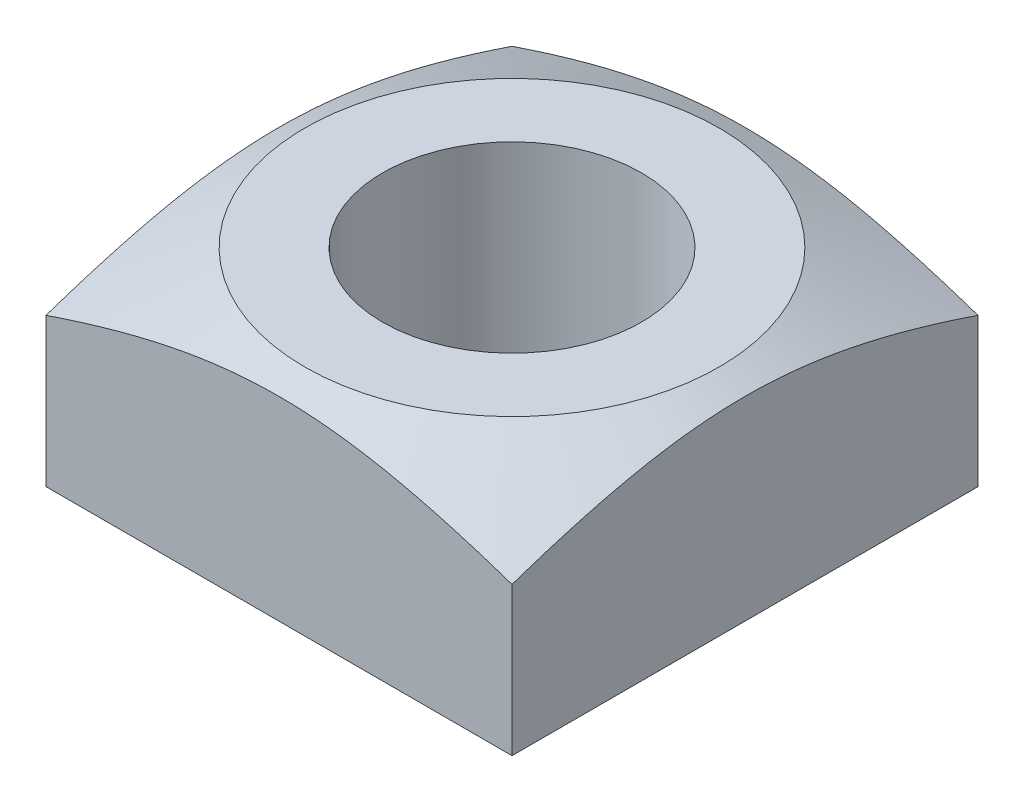
ISO-10303-21;
HEADER;
FILE_DESCRIPTION(('STEP AP214'),'2;1');
FILE_NAME('part.step','',(''),(''),'','','');
FILE_SCHEMA(('AUTOMOTIVE_DESIGN { 1 0 10303 214 1 1 1 1 }'));
ENDSEC;
DATA;
#1=APPLICATION_CONTEXT('core data for automotive mechanical design processes');
#2=APPLICATION_PROTOCOL_DEFINITION('international standard','automotive_design',2000,#1);
#3=PRODUCT_CONTEXT('',#1,'mechanical');
#4=PRODUCT('Part','Part','',(#3));
#5=PRODUCT_RELATED_PRODUCT_CATEGORY('part','',(#4));
#6=PRODUCT_DEFINITION_FORMATION('','',#4);
#7=PRODUCT_DEFINITION_CONTEXT('part definition',#1,'design');
#8=PRODUCT_DEFINITION('design','',#6,#7);
#9=PRODUCT_DEFINITION_SHAPE('','',#8);
#10=(LENGTH_UNIT() NAMED_UNIT(*) SI_UNIT(.MILLI.,.METRE.));
#11=(NAMED_UNIT(*) PLANE_ANGLE_UNIT() SI_UNIT($,.RADIAN.));
#12=(NAMED_UNIT(*) SI_UNIT($,.STERADIAN.) SOLID_ANGLE_UNIT());
#13=UNCERTAINTY_MEASURE_WITH_UNIT(LENGTH_MEASURE(1.E-05),#10,'distance_accuracy_value','');
#14=(GEOMETRIC_REPRESENTATION_CONTEXT(3) GLOBAL_UNCERTAINTY_ASSIGNED_CONTEXT((#13)) GLOBAL_UNIT_ASSIGNED_CONTEXT((#10,
#11,#12)) REPRESENTATION_CONTEXT('',''));
#15=CARTESIAN_POINT('',(0.,0.,0.));
#16=DIRECTION('',(0.,0.,1.));
#17=DIRECTION('',(1.,0.,0.));
#18=AXIS2_PLACEMENT_3D('',#15,#16,#17);
#19=CARTESIAN_POINT('',(0.,2.4,0.));
#20=DIRECTION('',(0.,1.,0.));
#21=DIRECTION('',(0.,0.,1.));
#22=AXIS2_PLACEMENT_3D('',#19,#20,#21);
#23=PLANE('',#22);
#24=CARTESIAN_POINT('',(0.,2.4,0.));
#25=DIRECTION('',(0.,1.,0.));
#26=DIRECTION('',(0.,0.,1.));
#27=AXIS2_PLACEMENT_3D('',#24,#25,#26);
#28=CIRCLE('',#27,1.5);
#29=CARTESIAN_POINT('',(0.,2.4,1.5));
#30=VERTEX_POINT('',#29);
#31=EDGE_CURVE('E120',#30,#30,#28,.T.);
#32=ORIENTED_EDGE('',*,*,#31,.F.);
#33=EDGE_LOOP('',(#32));
#34=FACE_BOUND('',#33,.T.);
#35=CARTESIAN_POINT('',(0.,2.4,0.));
#36=DIRECTION('',(0.,1.,0.));
#37=DIRECTION('',(0.,0.,1.));
#38=AXIS2_PLACEMENT_3D('',#35,#36,#37);
#39=CIRCLE('',#38,2.4);
#40=CARTESIAN_POINT('',(0.,2.4,2.4));
#41=VERTEX_POINT('',#40);
#42=EDGE_CURVE('E127',#41,#41,#39,.T.);
#43=ORIENTED_EDGE('',*,*,#42,.T.);
#44=EDGE_LOOP('',(#43));
#45=FACE_BOUND('',#44,.T.);
#46=ADVANCED_FACE('F40',(#34,#45),#23,.T.);
#47=CARTESIAN_POINT('',(0.,0.,0.));
#48=DIRECTION('',(0.,1.,0.));
#49=DIRECTION('',(0.,0.,1.));
#50=AXIS2_PLACEMENT_3D('',#47,#48,#49);
#51=PLANE('',#50);
#52=DIRECTION('',(0.,0.,1.));
#53=VECTOR('',#52,1.);
#54=CARTESIAN_POINT('',(-2.70000000000001,0.,2.69999999999999));
#55=LINE('',#54,#53);
#56=CARTESIAN_POINT('',(-2.70000000000001,0.,-2.70000000000001));
#57=VERTEX_POINT('',#56);
#58=CARTESIAN_POINT('',(-2.70000000000001,0.,2.69999999999999));
#59=VERTEX_POINT('',#58);
#60=EDGE_CURVE('E117',#57,#59,#55,.T.);
#61=ORIENTED_EDGE('',*,*,#60,.F.);
#62=DIRECTION('',(-1.,0.,0.));
#63=VECTOR('',#62,1.);
#64=CARTESIAN_POINT('',(2.69999999999999,0.,-2.70000000000001));
#65=LINE('',#64,#63);
#66=CARTESIAN_POINT('',(2.69999999999999,0.,-2.70000000000001));
#67=VERTEX_POINT('',#66);
#68=EDGE_CURVE('E97',#67,#57,#65,.T.);
#69=ORIENTED_EDGE('',*,*,#68,.F.);
#70=DIRECTION('',(0.,0.,-1.));
#71=VECTOR('',#70,1.);
#72=CARTESIAN_POINT('',(2.7,0.,2.7));
#73=LINE('',#72,#71);
#74=CARTESIAN_POINT('',(2.7,0.,2.7));
#75=VERTEX_POINT('',#74);
#76=EDGE_CURVE('E103',#75,#67,#73,.T.);
#77=ORIENTED_EDGE('',*,*,#76,.F.);
#78=DIRECTION('',(1.,0.,0.));
#79=VECTOR('',#78,1.);
#80=CARTESIAN_POINT('',(2.7,0.,2.7));
#81=LINE('',#80,#79);
#82=EDGE_CURVE('E112',#59,#75,#81,.T.);
#83=ORIENTED_EDGE('',*,*,#82,.F.);
#84=EDGE_LOOP('',(#61,#69,#77,#83));
#85=FACE_BOUND('',#84,.T.);
#86=CARTESIAN_POINT('',(0.,0.,0.));
#87=DIRECTION('',(0.,1.,0.));
#88=DIRECTION('',(0.,0.,1.));
#89=AXIS2_PLACEMENT_3D('',#86,#87,#88);
#90=CIRCLE('',#89,1.5);
#91=CARTESIAN_POINT('',(0.,0.,1.5));
#92=VERTEX_POINT('',#91);
#93=EDGE_CURVE('E92',#92,#92,#90,.T.);
#94=ORIENTED_EDGE('',*,*,#93,.T.);
#95=EDGE_LOOP('',(#94));
#96=FACE_BOUND('',#95,.T.);
#97=ADVANCED_FACE('F115',(#85,#96),#51,.F.);
#98=CARTESIAN_POINT('',(-2.70000000000001,2.4,2.69999999999999));
#99=DIRECTION('',(1.,0.,0.));
#100=DIRECTION('',(0.,0.,-1.));
#101=AXIS2_PLACEMENT_3D('',#98,#99,#100);
#102=PLANE('',#101);
#103=DIRECTION('',(0.,-1.,0.));
#104=VECTOR('',#103,1.);
#105=CARTESIAN_POINT('',(-2.70000000000001,2.4,2.69999999999999));
#106=LINE('',#105,#104);
#107=CARTESIAN_POINT('',(-2.70000000000029,1.71917922316458,2.69999999999999));
#108=VERTEX_POINT('',#107);
#109=EDGE_CURVE('E55',#108,#59,#106,.T.);
#110=ORIENTED_EDGE('',*,*,#109,.F.);
#111=CARTESIAN_POINT('',(-2.70000000000001,-0.606435247101683,8.23192667437573));
#112=CARTESIAN_POINT('',(-2.70000000000001,-0.506822215846075,8.01349467702338));
#113=CARTESIAN_POINT('',(-2.70000000000001,-0.40750804153311,7.79492548024702));
#114=CARTESIAN_POINT('',(-2.70000000000001,-0.209682707755097,7.35741473554905));
#115=CARTESIAN_POINT('',(-2.70000000000001,-0.111171577103838,7.13847317460445));
#116=CARTESIAN_POINT('',(-2.70000000000001,0.0849397759665151,6.69990152335025));
#117=CARTESIAN_POINT('',(-2.70000000000001,0.182538914464492,6.4802709476763));
#118=CARTESIAN_POINT('',(-2.70000000000001,0.376403252058409,6.04042685447661));
#119=CARTESIAN_POINT('',(-2.70000000000001,0.472668479636916,5.82021334951793));
#120=CARTESIAN_POINT('',(-2.70000000000001,0.671554672542732,5.36022219683892));
#121=CARTESIAN_POINT('',(-2.70000000000001,0.774018308811196,5.12037630283562));
#122=CARTESIAN_POINT('',(-2.70000000000001,0.976006948004834,4.63945259953601));
#123=CARTESIAN_POINT('',(-2.70000000000001,1.07553200603543,4.39837481344023));
#124=CARTESIAN_POINT('',(-2.70000000000001,1.27031686857536,3.9145006293873));
#125=CARTESIAN_POINT('',(-2.70000000000001,1.36557691831542,3.67170433117371));
#126=CARTESIAN_POINT('',(-2.70000000000001,1.50358143775901,3.30567931459696));
#127=CARTESIAN_POINT('',(-2.70000000000001,1.54876651769645,3.18337212906639));
#128=CARTESIAN_POINT('',(-2.70000000000001,1.63708505119091,2.93802105780318));
#129=CARTESIAN_POINT('',(-2.70000000000001,1.68021857669607,2.81497719807638));
#130=CARTESIAN_POINT('',(-2.70000000000001,1.76479613598742,2.56539403710119));
#131=CARTESIAN_POINT('',(-2.70000000000001,1.80618497332129,2.43883593004486));
#132=CARTESIAN_POINT('',(-2.70000000000001,1.88553581877887,2.1846554683488));
#133=CARTESIAN_POINT('',(-2.70000000000001,1.92349815817011,2.05703321789447));
#134=CARTESIAN_POINT('',(-2.70000000000001,1.9950515865891,1.80058310364117));
#135=CARTESIAN_POINT('',(-2.70000000000001,2.0286435037053,1.67175547320542));
#136=CARTESIAN_POINT('',(-2.70000000000001,2.09030148832002,1.41276667988722));
#137=CARTESIAN_POINT('',(-2.70000000000001,2.11836758590939,1.28260552427055));
#138=CARTESIAN_POINT('',(-2.70000000000001,2.16697360111399,1.02451675874272));
#139=CARTESIAN_POINT('',(-2.70000000000001,2.18769693400819,0.896624265870415));
#140=CARTESIAN_POINT('',(-2.70000000000001,2.22142664655635,0.639818060645532));
#141=CARTESIAN_POINT('',(-2.70000000000001,2.23443388357094,0.510904463364826));
#142=CARTESIAN_POINT('',(-2.70000000000001,2.25178276757696,0.252646946090538));
#143=CARTESIAN_POINT('',(-2.70000000000001,2.25613549071915,0.123303788607147));
#144=CARTESIAN_POINT('',(-2.70000000000001,2.25585803505028,-0.135373186766508));
#145=CARTESIAN_POINT('',(-2.70000000000001,2.25122782019563,-0.264707004617214));
#146=CARTESIAN_POINT('',(-2.70000000000001,2.23335420909054,-0.52279990649601));
#147=CARTESIAN_POINT('',(-2.70000000000001,2.22010838049752,-0.651558817878641));
#148=CARTESIAN_POINT('',(-2.70000000000001,2.18595123928292,-0.908047247042929));
#149=CARTESIAN_POINT('',(-2.70000000000001,2.16503914149077,-1.03577665801441));
#150=CARTESIAN_POINT('',(-2.70000000000001,2.11672590597123,-1.29024066840712));
#151=CARTESIAN_POINT('',(-2.70000000000001,2.08931213144147,-1.41697282763452));
#152=CARTESIAN_POINT('',(-2.70000000000001,2.02924630518163,-1.66917265822671));
#153=CARTESIAN_POINT('',(-2.70000000000001,1.99659427143826,-1.79464033393182));
#154=CARTESIAN_POINT('',(-2.70000000000001,1.92613474535251,-2.04797923026407));
#155=CARTESIAN_POINT('',(-2.70000000000001,1.88820650714308,-2.17581655339833));
#156=CARTESIAN_POINT('',(-2.70000000000001,1.8088991283155,-2.43040716279315));
#157=CARTESIAN_POINT('',(-2.70000000000001,1.76752000500831,-2.55716045448811));
#158=CARTESIAN_POINT('',(-2.70000000000001,1.68209473047967,-2.80962415323683));
#159=CARTESIAN_POINT('',(-2.70000000000001,1.63805118726447,-2.93533544741497));
#160=CARTESIAN_POINT('',(-2.70000000000001,1.54782487849784,-3.18598968451544));
#161=CARTESIAN_POINT('',(-2.70000000000001,1.50164203659316,-3.31093259983317));
#162=CARTESIAN_POINT('',(-2.70000000000001,1.37529940284181,-3.64572197686884));
#163=CARTESIAN_POINT('',(-2.70000000000001,1.29357735156,-3.85497793018507));
#164=CARTESIAN_POINT('',(-2.70000000000001,1.12678758066689,-4.27215145086381));
#165=CARTESIAN_POINT('',(-2.70000000000001,1.04171972856756,-4.48006896484629));
#166=CARTESIAN_POINT('',(-2.70000000000001,0.869140853428636,-4.89498497328981));
#167=CARTESIAN_POINT('',(-2.70000000000001,0.781628844274619,-5.10198305659208));
#168=CARTESIAN_POINT('',(-2.70000000000001,0.604828100084038,-5.51521885976111));
#169=CARTESIAN_POINT('',(-2.70000000000001,0.515539352242739,-5.72145657413529));
#170=CARTESIAN_POINT('',(-2.70000000000001,0.341315330656772,-6.12030386527071));
#171=CARTESIAN_POINT('',(-2.70000000000001,0.256462399772668,-6.31294946626508));
#172=CARTESIAN_POINT('',(-2.70000000000001,0.0858312489666655,-6.69783145015282));
#173=CARTESIAN_POINT('',(-2.70000000000001,5.3023552096018E-05,-6.89006783060888));
#174=CARTESIAN_POINT('',(-2.70000000000001,-0.172172180875994,-7.27406276161231));
#175=CARTESIAN_POINT('',(-2.70000000000001,-0.258618594318572,-7.46582156606016));
#176=CARTESIAN_POINT('',(-2.70000000000001,-0.432110616019693,-7.84906479320019));
#177=CARTESIAN_POINT('',(-2.70000000000001,-0.519156215923214,-8.04054921967349));
#178=CARTESIAN_POINT('',(-2.70000000000001,-0.60643524710169,-8.23192667437574));
#179=B_SPLINE_CURVE_WITH_KNOTS('',3,(#111,#112,#113,#114,#115,#116,#117,#118,#119,#120,#121,
#122,#123,#124,#125,#126,#127,#128,#129,#130,#131,#132,#133,#134,#135,#136,#137,#138,#139,#140,
#141,#142,#143,#144,#145,#146,#147,#148,#149,#150,#151,#152,#153,#154,#155,#156,#157,#158,#159,
#160,#161,#162,#163,#164,#165,#166,#167,#168,#169,#170,#171,#172,#173,#174,#175,#176,#177,#178),
.UNSPECIFIED.,.F.,.F.,(4,2,2,2,2,2,2,2,2,2,2,2,2,2,2,2,2,2,2,2,2,2,2,2,2,2,2,2,2,2,2,2,2,4),(0.,
0.720221554211858,1.44046883774401,2.16148451475411,2.88248477235222,3.66491746483832,
4.44733547549691,5.22970844052507,5.62085525746432,6.01198834672753,6.41141271220445,
6.81079842061164,7.21010834461465,7.60941609411566,7.99789809332225,8.38633691893544,
8.77427829506383,9.16222122779064,9.55027373134427,9.93836598990308,10.3272188257001,
10.716070326315,11.1160439034166,11.5160154742171,11.9156016853266,12.3152021689834,
12.989098009983,13.6630205630298,14.337219059243,15.011422416082,15.6429343889301,
16.2744501125816,16.905479748322,17.5365006027746),.UNSPECIFIED.);
#180=CARTESIAN_POINT('',(-2.69999999999994,1.7191792231645,-2.70000000000001));
#181=VERTEX_POINT('',#180);
#182=EDGE_CURVE('E87',#108,#181,#179,.T.);
#183=ORIENTED_EDGE('',*,*,#182,.T.);
#184=DIRECTION('',(0.,-1.,0.));
#185=VECTOR('',#184,1.);
#186=CARTESIAN_POINT('',(-2.70000000000001,2.4,-2.70000000000001));
#187=LINE('',#186,#185);
#188=EDGE_CURVE('E69',#181,#57,#187,.T.);
#189=ORIENTED_EDGE('',*,*,#188,.T.);
#190=ORIENTED_EDGE('',*,*,#60,.T.);
#191=EDGE_LOOP('',(#110,#183,#189,#190));
#192=FACE_BOUND('',#191,.T.);
#193=ADVANCED_FACE('F42',(#192),#102,.F.);
#194=CARTESIAN_POINT('',(2.7,2.4,2.7));
#195=DIRECTION('',(0.,0.,-1.));
#196=DIRECTION('',(-1.,0.,0.));
#197=AXIS2_PLACEMENT_3D('',#194,#195,#196);
#198=PLANE('',#197);
#199=DIRECTION('',(0.,-1.,0.));
#200=VECTOR('',#199,1.);
#201=CARTESIAN_POINT('',(2.7,2.4,2.7));
#202=LINE('',#201,#200);
#203=CARTESIAN_POINT('',(2.7,1.71917922316459,2.70000000000027));
#204=VERTEX_POINT('',#203);
#205=EDGE_CURVE('E101',#204,#75,#202,.T.);
#206=ORIENTED_EDGE('',*,*,#205,.F.);
#207=CARTESIAN_POINT('',(8.23192667437574,-0.606435247101685,2.7));
#208=CARTESIAN_POINT('',(8.01349467702339,-0.506822215846078,2.7));
#209=CARTESIAN_POINT('',(7.79492548024703,-0.407508041533113,2.7));
#210=CARTESIAN_POINT('',(7.35741473554906,-0.209682707755099,2.7));
#211=CARTESIAN_POINT('',(7.13847317460446,-0.11117157710384,2.7));
#212=CARTESIAN_POINT('',(6.69990152335026,0.0849397759665129,2.7));
#213=CARTESIAN_POINT('',(6.48027094767631,0.182538914464489,2.7));
#214=CARTESIAN_POINT('',(6.04042685447662,0.376403252058406,2.7));
#215=CARTESIAN_POINT('',(5.82021334951793,0.472668479636914,2.7));
#216=CARTESIAN_POINT('',(5.36022219683893,0.671554672542731,2.7));
#217=CARTESIAN_POINT('',(5.12037630283562,0.774018308811195,2.7));
#218=CARTESIAN_POINT('',(4.63945259953602,0.976006948004834,2.7));
#219=CARTESIAN_POINT('',(4.39837481344024,1.07553200603543,2.7));
#220=CARTESIAN_POINT('',(3.91450062938731,1.27031686857536,2.7));
#221=CARTESIAN_POINT('',(3.67170433117372,1.36557691831542,2.7));
#222=CARTESIAN_POINT('',(3.30567931459697,1.50358143775901,2.7));
#223=CARTESIAN_POINT('',(3.1833721290664,1.54876651769645,2.7));
#224=CARTESIAN_POINT('',(2.93802105780319,1.63708505119091,2.7));
#225=CARTESIAN_POINT('',(2.8149771980764,1.68021857669607,2.7));
#226=CARTESIAN_POINT('',(2.5653940371012,1.76479613598742,2.7));
#227=CARTESIAN_POINT('',(2.43883593004487,1.80618497332129,2.7));
#228=CARTESIAN_POINT('',(2.18465546834881,1.88553581877887,2.7));
#229=CARTESIAN_POINT('',(2.05703321789448,1.92349815817012,2.7));
#230=CARTESIAN_POINT('',(1.80058310364119,1.9950515865891,2.7));
#231=CARTESIAN_POINT('',(1.67175547320543,2.02864350370531,2.7));
#232=CARTESIAN_POINT('',(1.41276667988724,2.09030148832003,2.7));
#233=CARTESIAN_POINT('',(1.28260552427056,2.11836758590939,2.7));
#234=CARTESIAN_POINT('',(1.02451675874274,2.16697360111399,2.7));
#235=CARTESIAN_POINT('',(0.896624265870433,2.18769693400819,2.7));
#236=CARTESIAN_POINT('',(0.63981806064555,2.22142664655636,2.7));
#237=CARTESIAN_POINT('',(0.510904463364845,2.23443388357095,2.7));
#238=CARTESIAN_POINT('',(0.252646946090558,2.25178276757696,2.7));
#239=CARTESIAN_POINT('',(0.123303788607168,2.25613549071916,2.7));
#240=CARTESIAN_POINT('',(-0.135373186766486,2.25585803505029,2.7));
#241=CARTESIAN_POINT('',(-0.264707004617191,2.25122782019564,2.7));
#242=CARTESIAN_POINT('',(-0.522799906495988,2.23335420909055,2.7));
#243=CARTESIAN_POINT('',(-0.651558817878619,2.22010838049753,2.7));
#244=CARTESIAN_POINT('',(-0.908047247042907,2.18595123928294,2.7));
#245=CARTESIAN_POINT('',(-1.03577665801438,2.16503914149078,2.69999999999999));
#246=CARTESIAN_POINT('',(-1.2902406684071,2.11672590597125,2.69999999999999));
#247=CARTESIAN_POINT('',(-1.41697282763449,2.08931213144148,2.69999999999999));
#248=CARTESIAN_POINT('',(-1.66917265822669,2.02924630518164,2.69999999999999));
#249=CARTESIAN_POINT('',(-1.79464033393179,1.99659427143827,2.69999999999999));
#250=CARTESIAN_POINT('',(-2.04797923026405,1.92613474535253,2.69999999999999));
#251=CARTESIAN_POINT('',(-2.17581655339831,1.8882065071431,2.69999999999999));
#252=CARTESIAN_POINT('',(-2.43040716279312,1.80889912831551,2.69999999999999));
#253=CARTESIAN_POINT('',(-2.55716045448809,1.76752000500833,2.69999999999999));
#254=CARTESIAN_POINT('',(-2.8096241532368,1.68209473047969,2.69999999999999));
#255=CARTESIAN_POINT('',(-2.93533544741494,1.63805118726449,2.69999999999999));
#256=CARTESIAN_POINT('',(-3.18598968451541,1.54782487849785,2.69999999999999));
#257=CARTESIAN_POINT('',(-3.31093259983314,1.50164203659318,2.69999999999999));
#258=CARTESIAN_POINT('',(-3.64572197686881,1.37529940284183,2.69999999999999));
#259=CARTESIAN_POINT('',(-3.85497793018504,1.29357735156002,2.69999999999999));
#260=CARTESIAN_POINT('',(-4.27215145086379,1.1267875806669,2.69999999999999));
#261=CARTESIAN_POINT('',(-4.48006896484627,1.04171972856757,2.69999999999999));
#262=CARTESIAN_POINT('',(-4.8949849732898,0.869140853428646,2.69999999999999));
#263=CARTESIAN_POINT('',(-5.10198305659206,0.781628844274628,2.69999999999999));
#264=CARTESIAN_POINT('',(-5.5152188597611,0.604828100084046,2.69999999999999));
#265=CARTESIAN_POINT('',(-5.72145657413529,0.515539352242746,2.69999999999999));
#266=CARTESIAN_POINT('',(-6.12030386527071,0.341315330656778,2.69999999999999));
#267=CARTESIAN_POINT('',(-6.31294946626507,0.256462399772674,2.69999999999999));
#268=CARTESIAN_POINT('',(-6.69783145015281,0.0858312489666705,2.69999999999999));
#269=CARTESIAN_POINT('',(-6.89006783060888,5.30235521005717E-05,2.69999999999999));
#270=CARTESIAN_POINT('',(-7.27406276161231,-0.172172180875991,2.69999999999999));
#271=CARTESIAN_POINT('',(-7.46582156606016,-0.25861859431857,2.69999999999999));
#272=CARTESIAN_POINT('',(-7.84906479320019,-0.432110616019693,2.69999999999999));
#273=CARTESIAN_POINT('',(-8.0405492196735,-0.519156215923214,2.69999999999999));
#274=CARTESIAN_POINT('',(-8.23192667437575,-0.60643524710169,2.69999999999999));
#275=B_SPLINE_CURVE_WITH_KNOTS('',3,(#207,#208,#209,#210,#211,#212,#213,#214,#215,#216,#217,
#218,#219,#220,#221,#222,#223,#224,#225,#226,#227,#228,#229,#230,#231,#232,#233,#234,#235,#236,
#237,#238,#239,#240,#241,#242,#243,#244,#245,#246,#247,#248,#249,#250,#251,#252,#253,#254,#255,
#256,#257,#258,#259,#260,#261,#262,#263,#264,#265,#266,#267,#268,#269,#270,#271,#272,#273,#274),
.UNSPECIFIED.,.F.,.F.,(4,2,2,2,2,2,2,2,2,2,2,2,2,2,2,2,2,2,2,2,2,2,2,2,2,2,2,2,2,2,2,2,2,4),(0.,
0.720221554211857,1.44046883774401,2.16148451475411,2.88248477235222,3.66491746483832,
4.44733547549691,5.22970844052507,5.62085525746432,6.01198834672753,6.41141271220445,
6.81079842061163,7.21010834461465,7.60941609411566,7.99789809332225,8.38633691893543,
8.77427829506382,9.16222122779063,9.55027373134426,9.93836598990307,10.3272188257001,
10.716070326315,11.1160439034166,11.5160154742171,11.9156016853265,12.3152021689834,
12.989098009983,13.6630205630298,14.337219059243,15.011422416082,15.6429343889301,
16.2744501125817,16.905479748322,17.5365006027746),.UNSPECIFIED.);
#276=EDGE_CURVE('E93',#204,#108,#275,.T.);
#277=ORIENTED_EDGE('',*,*,#276,.T.);
#278=ORIENTED_EDGE('',*,*,#109,.T.);
#279=ORIENTED_EDGE('',*,*,#82,.T.);
#280=EDGE_LOOP('',(#206,#277,#278,#279));
#281=FACE_BOUND('',#280,.T.);
#282=ADVANCED_FACE('F111',(#281),#198,.F.);
#283=CARTESIAN_POINT('',(2.7,2.4,2.7));
#284=DIRECTION('',(-1.,0.,0.));
#285=DIRECTION('',(0.,0.,1.));
#286=AXIS2_PLACEMENT_3D('',#283,#284,#285);
#287=PLANE('',#286);
#288=DIRECTION('',(0.,-1.,0.));
#289=VECTOR('',#288,1.);
#290=CARTESIAN_POINT('',(2.69999999999999,2.4,-2.70000000000001));
#291=LINE('',#290,#289);
#292=CARTESIAN_POINT('',(2.69999999999999,1.71917922316447,-2.70000000000001));
#293=VERTEX_POINT('',#292);
#294=EDGE_CURVE('E99',#293,#67,#291,.T.);
#295=ORIENTED_EDGE('',*,*,#294,.F.);
#296=CARTESIAN_POINT('',(2.69999999999998,-0.606435247101692,-8.23192667437576));
#297=CARTESIAN_POINT('',(2.69999999999998,-0.506822215846085,-8.01349467702341));
#298=CARTESIAN_POINT('',(2.69999999999998,-0.40750804153312,-7.79492548024705));
#299=CARTESIAN_POINT('',(2.69999999999998,-0.209682707755106,-7.35741473554908));
#300=CARTESIAN_POINT('',(2.69999999999999,-0.111171577103847,-7.13847317460448));
#301=CARTESIAN_POINT('',(2.69999999999999,0.0849397759665071,-6.69990152335028));
#302=CARTESIAN_POINT('',(2.69999999999999,0.182538914464483,-6.48027094767633));
#303=CARTESIAN_POINT('',(2.69999999999999,0.376403252058401,-6.04042685447664));
#304=CARTESIAN_POINT('',(2.69999999999999,0.472668479636909,-5.82021334951795));
#305=CARTESIAN_POINT('',(2.69999999999999,0.671554672542726,-5.36022219683895));
#306=CARTESIAN_POINT('',(2.69999999999999,0.774018308811191,-5.12037630283564));
#307=CARTESIAN_POINT('',(2.69999999999999,0.97600694800483,-4.63945259953604));
#308=CARTESIAN_POINT('',(2.69999999999999,1.07553200603542,-4.39837481344026));
#309=CARTESIAN_POINT('',(2.69999999999999,1.27031686857536,-3.91450062938732));
#310=CARTESIAN_POINT('',(2.69999999999999,1.36557691831541,-3.67170433117373));
#311=CARTESIAN_POINT('',(2.69999999999999,1.50358143775901,-3.30567931459698));
#312=CARTESIAN_POINT('',(2.69999999999999,1.54876651769645,-3.18337212906641));
#313=CARTESIAN_POINT('',(2.69999999999999,1.63708505119091,-2.9380210578032));
#314=CARTESIAN_POINT('',(2.69999999999999,1.68021857669607,-2.8149771980764));
#315=CARTESIAN_POINT('',(2.69999999999999,1.76479613598742,-2.56539403710121));
#316=CARTESIAN_POINT('',(2.69999999999999,1.80618497332129,-2.43883593004488));
#317=CARTESIAN_POINT('',(2.69999999999999,1.88553581877887,-2.18465546834882));
#318=CARTESIAN_POINT('',(2.69999999999999,1.92349815817012,-2.05703321789449));
#319=CARTESIAN_POINT('',(2.69999999999999,1.99505158658911,-1.80058310364119));
#320=CARTESIAN_POINT('',(2.69999999999999,2.02864350370531,-1.67175547320544));
#321=CARTESIAN_POINT('',(2.69999999999999,2.09030148832003,-1.41276667988724));
#322=CARTESIAN_POINT('',(2.69999999999999,2.11836758590939,-1.28260552427057));
#323=CARTESIAN_POINT('',(2.69999999999999,2.16697360111399,-1.02451675874274));
#324=CARTESIAN_POINT('',(2.69999999999999,2.18769693400819,-0.896624265870438));
#325=CARTESIAN_POINT('',(2.69999999999999,2.22142664655636,-0.639818060645556));
#326=CARTESIAN_POINT('',(2.69999999999999,2.23443388357095,-0.51090446336485));
#327=CARTESIAN_POINT('',(2.69999999999999,2.25178276757696,-0.252646946090562));
#328=CARTESIAN_POINT('',(2.69999999999999,2.25613549071916,-0.123303788607171));
#329=CARTESIAN_POINT('',(2.69999999999999,2.25585803505029,0.135373186766483));
#330=CARTESIAN_POINT('',(2.69999999999999,2.25122782019564,0.264707004617189));
#331=CARTESIAN_POINT('',(2.69999999999999,2.23335420909055,0.522799906495986));
#332=CARTESIAN_POINT('',(2.69999999999999,2.22010838049753,0.651558817878617));
#333=CARTESIAN_POINT('',(2.69999999999999,2.18595123928294,0.908047247042904));
#334=CARTESIAN_POINT('',(2.69999999999999,2.16503914149078,1.03577665801438));
#335=CARTESIAN_POINT('',(2.7,2.11672590597125,1.29024066840709));
#336=CARTESIAN_POINT('',(2.7,2.08931213144148,1.41697282763449));
#337=CARTESIAN_POINT('',(2.7,2.02924630518164,1.66917265822668));
#338=CARTESIAN_POINT('',(2.7,1.99659427143827,1.79464033393179));
#339=CARTESIAN_POINT('',(2.7,1.92613474535253,2.04797923026405));
#340=CARTESIAN_POINT('',(2.7,1.88820650714309,2.17581655339831));
#341=CARTESIAN_POINT('',(2.7,1.80889912831551,2.43040716279312));
#342=CARTESIAN_POINT('',(2.7,1.76752000500833,2.55716045448809));
#343=CARTESIAN_POINT('',(2.7,1.68209473047969,2.8096241532368));
#344=CARTESIAN_POINT('',(2.7,1.63805118726449,2.93533544741494));
#345=CARTESIAN_POINT('',(2.7,1.54782487849785,3.18598968451541));
#346=CARTESIAN_POINT('',(2.7,1.50164203659318,3.31093259983314));
#347=CARTESIAN_POINT('',(2.7,1.37529940284182,3.64572197686881));
#348=CARTESIAN_POINT('',(2.7,1.29357735156002,3.85497793018504));
#349=CARTESIAN_POINT('',(2.7,1.1267875806669,4.27215145086379));
#350=CARTESIAN_POINT('',(2.7,1.04171972856757,4.48006896484627));
#351=CARTESIAN_POINT('',(2.7,0.869140853428645,4.89498497328979));
#352=CARTESIAN_POINT('',(2.7,0.781628844274627,5.10198305659206));
#353=CARTESIAN_POINT('',(2.7,0.604828100084046,5.5152188597611));
#354=CARTESIAN_POINT('',(2.7,0.515539352242746,5.72145657413528));
#355=CARTESIAN_POINT('',(2.7,0.341315330656778,6.1203038652707));
#356=CARTESIAN_POINT('',(2.7,0.256462399772674,6.31294946626507));
#357=CARTESIAN_POINT('',(2.7,0.0858312489666704,6.69783145015281));
#358=CARTESIAN_POINT('',(2.7,5.30235521008834E-05,6.89006783060888));
#359=CARTESIAN_POINT('',(2.7,-0.17217218087599,7.27406276161231));
#360=CARTESIAN_POINT('',(2.7,-0.258618594318569,7.46582156606015));
#361=CARTESIAN_POINT('',(2.7,-0.43211061601969,7.84906479320019));
#362=CARTESIAN_POINT('',(2.7,-0.519156215923211,8.04054921967349));
#363=CARTESIAN_POINT('',(2.7,-0.606435247101687,8.23192667437574));
#364=B_SPLINE_CURVE_WITH_KNOTS('',3,(#296,#297,#298,#299,#300,#301,#302,#303,#304,#305,#306,
#307,#308,#309,#310,#311,#312,#313,#314,#315,#316,#317,#318,#319,#320,#321,#322,#323,#324,#325,
#326,#327,#328,#329,#330,#331,#332,#333,#334,#335,#336,#337,#338,#339,#340,#341,#342,#343,#344,
#345,#346,#347,#348,#349,#350,#351,#352,#353,#354,#355,#356,#357,#358,#359,#360,#361,#362,#363),
.UNSPECIFIED.,.F.,.F.,(4,2,2,2,2,2,2,2,2,2,2,2,2,2,2,2,2,2,2,2,2,2,2,2,2,2,2,2,2,2,2,2,2,4),(0.,
0.720221554211857,1.44046883774401,2.16148451475412,2.88248477235223,3.66491746483833,
4.44733547549692,5.22970844052508,5.62085525746433,6.01198834672754,6.41141271220447,
6.81079842061165,7.21010834461466,7.60941609411568,7.99789809332227,8.38633691893545,
8.77427829506384,9.16222122779065,9.55027373134428,9.93836598990309,10.3272188257001,
10.716070326315,11.1160439034166,11.5160154742171,11.9156016853266,12.3152021689834,
12.989098009983,13.6630205630298,14.337219059243,15.011422416082,15.6429343889301,
16.2744501125817,16.905479748322,17.5365006027746),.UNSPECIFIED.);
#365=EDGE_CURVE('E62',#293,#204,#364,.T.);
#366=ORIENTED_EDGE('',*,*,#365,.T.);
#367=ORIENTED_EDGE('',*,*,#205,.T.);
#368=ORIENTED_EDGE('',*,*,#76,.T.);
#369=EDGE_LOOP('',(#295,#366,#367,#368));
#370=FACE_BOUND('',#369,.T.);
#371=ADVANCED_FACE('F126',(#370),#287,.F.);
#372=CARTESIAN_POINT('',(2.69999999999999,2.4,-2.70000000000001));
#373=DIRECTION('',(0.,0.,1.));
#374=DIRECTION('',(1.,0.,0.));
#375=AXIS2_PLACEMENT_3D('',#372,#373,#374);
#376=PLANE('',#375);
#377=ORIENTED_EDGE('',*,*,#188,.F.);
#378=CARTESIAN_POINT('',(-8.23192667437575,-0.606435247101689,-2.7));
#379=CARTESIAN_POINT('',(-8.0134946770234,-0.506822215846082,-2.7));
#380=CARTESIAN_POINT('',(-7.79492548024703,-0.407508041533116,-2.7));
#381=CARTESIAN_POINT('',(-7.35741473554906,-0.209682707755103,-2.7));
#382=CARTESIAN_POINT('',(-7.13847317460446,-0.111171577103844,-2.7));
#383=CARTESIAN_POINT('',(-6.69990152335027,0.0849397759665104,-2.7));
#384=CARTESIAN_POINT('',(-6.48027094767632,0.182538914464487,-2.7));
#385=CARTESIAN_POINT('',(-6.04042685447662,0.376403252058405,-2.7));
#386=CARTESIAN_POINT('',(-5.82021334951794,0.472668479636912,-2.7));
#387=CARTESIAN_POINT('',(-5.36022219683893,0.671554672542728,-2.7));
#388=CARTESIAN_POINT('',(-5.12037630283563,0.774018308811193,-2.70000000000001));
#389=CARTESIAN_POINT('',(-4.63945259953602,0.976006948004831,-2.70000000000001));
#390=CARTESIAN_POINT('',(-4.39837481344024,1.07553200603542,-2.70000000000001));
#391=CARTESIAN_POINT('',(-3.91450062938731,1.27031686857536,-2.70000000000001));
#392=CARTESIAN_POINT('',(-3.67170433117372,1.36557691831541,-2.70000000000001));
#393=CARTESIAN_POINT('',(-3.30567931459697,1.50358143775901,-2.70000000000001));
#394=CARTESIAN_POINT('',(-3.1833721290664,1.54876651769645,-2.70000000000001));
#395=CARTESIAN_POINT('',(-2.93802105780319,1.6370850511909,-2.70000000000001));
#396=CARTESIAN_POINT('',(-2.81497719807639,1.68021857669607,-2.70000000000001));
#397=CARTESIAN_POINT('',(-2.5653940371012,1.76479613598742,-2.70000000000001));
#398=CARTESIAN_POINT('',(-2.43883593004487,1.80618497332129,-2.70000000000001));
#399=CARTESIAN_POINT('',(-2.18465546834881,1.88553581877887,-2.70000000000001));
#400=CARTESIAN_POINT('',(-2.05703321789448,1.92349815817011,-2.70000000000001));
#401=CARTESIAN_POINT('',(-1.80058310364118,1.9950515865891,-2.70000000000001));
#402=CARTESIAN_POINT('',(-1.67175547320543,2.0286435037053,-2.70000000000001));
#403=CARTESIAN_POINT('',(-1.41276667988723,2.09030148832002,-2.70000000000001));
#404=CARTESIAN_POINT('',(-1.28260552427055,2.11836758590939,-2.70000000000001));
#405=CARTESIAN_POINT('',(-1.02451675874273,2.16697360111399,-2.70000000000001));
#406=CARTESIAN_POINT('',(-0.896624265870423,2.18769693400819,-2.70000000000001));
#407=CARTESIAN_POINT('',(-0.63981806064554,2.22142664655635,-2.70000000000001));
#408=CARTESIAN_POINT('',(-0.510904463364834,2.23443388357094,-2.70000000000001));
#409=CARTESIAN_POINT('',(-0.252646946090547,2.25178276757696,-2.70000000000001));
#410=CARTESIAN_POINT('',(-0.123303788607155,2.25613549071915,-2.70000000000001));
#411=CARTESIAN_POINT('',(0.1353731867665,2.25585803505028,-2.70000000000001));
#412=CARTESIAN_POINT('',(0.264707004617206,2.25122782019563,-2.70000000000001));
#413=CARTESIAN_POINT('',(0.522799906496003,2.23335420909054,-2.70000000000001));
#414=CARTESIAN_POINT('',(0.651558817878635,2.22010838049752,-2.70000000000001));
#415=CARTESIAN_POINT('',(0.908047247042922,2.18595123928292,-2.70000000000001));
#416=CARTESIAN_POINT('',(1.0357766580144,2.16503914149077,-2.70000000000001));
#417=CARTESIAN_POINT('',(1.29024066840711,2.11672590597124,-2.70000000000001));
#418=CARTESIAN_POINT('',(1.41697282763451,2.08931213144147,-2.70000000000001));
#419=CARTESIAN_POINT('',(1.6691726582267,2.02924630518163,-2.70000000000001));
#420=CARTESIAN_POINT('',(1.79464033393181,1.99659427143826,-2.70000000000001));
#421=CARTESIAN_POINT('',(2.04797923026407,1.92613474535251,-2.70000000000001));
#422=CARTESIAN_POINT('',(2.17581655339833,1.88820650714308,-2.70000000000001));
#423=CARTESIAN_POINT('',(2.43040716279315,1.8088991283155,-2.70000000000001));
#424=CARTESIAN_POINT('',(2.55716045448811,1.76752000500831,-2.70000000000001));
#425=CARTESIAN_POINT('',(2.80962415323682,1.68209473047967,-2.70000000000001));
#426=CARTESIAN_POINT('',(2.93533544741496,1.63805118726447,-2.70000000000002));
#427=CARTESIAN_POINT('',(3.18598968451543,1.54782487849784,-2.70000000000002));
#428=CARTESIAN_POINT('',(3.31093259983316,1.50164203659316,-2.70000000000002));
#429=CARTESIAN_POINT('',(3.64572197686883,1.37529940284181,-2.70000000000002));
#430=CARTESIAN_POINT('',(3.85497793018506,1.29357735156,-2.70000000000002));
#431=CARTESIAN_POINT('',(4.27215145086381,1.12678758066689,-2.70000000000002));
#432=CARTESIAN_POINT('',(4.48006896484628,1.04171972856756,-2.70000000000002));
#433=CARTESIAN_POINT('',(4.8949849732898,0.869140853428637,-2.70000000000002));
#434=CARTESIAN_POINT('',(5.10198305659207,0.78162884427462,-2.70000000000002));
#435=CARTESIAN_POINT('',(5.51521885976111,0.60482810008404,-2.70000000000002));
#436=CARTESIAN_POINT('',(5.72145657413528,0.515539352242741,-2.70000000000002));
#437=CARTESIAN_POINT('',(6.12030386527071,0.341315330656774,-2.70000000000002));
#438=CARTESIAN_POINT('',(6.31294946626507,0.256462399772671,-2.70000000000002));
#439=CARTESIAN_POINT('',(6.6978314501528,0.0858312489666686,-2.70000000000002));
#440=CARTESIAN_POINT('',(6.89006783060887,5.30235520999482E-05,-2.70000000000002));
#441=CARTESIAN_POINT('',(7.2740627616123,-0.172172180875989,-2.70000000000002));
#442=CARTESIAN_POINT('',(7.46582156606014,-0.258618594318567,-2.70000000000002));
#443=CARTESIAN_POINT('',(7.84906479320018,-0.432110616019688,-2.70000000000002));
#444=CARTESIAN_POINT('',(8.04054921967347,-0.519156215923208,-2.70000000000002));
#445=CARTESIAN_POINT('',(8.23192667437573,-0.606435247101683,-2.70000000000002));
#446=B_SPLINE_CURVE_WITH_KNOTS('',3,(#378,#379,#380,#381,#382,#383,#384,#385,#386,#387,#388,
#389,#390,#391,#392,#393,#394,#395,#396,#397,#398,#399,#400,#401,#402,#403,#404,#405,#406,#407,
#408,#409,#410,#411,#412,#413,#414,#415,#416,#417,#418,#419,#420,#421,#422,#423,#424,#425,#426,
#427,#428,#429,#430,#431,#432,#433,#434,#435,#436,#437,#438,#439,#440,#441,#442,#443,#444,#445),
.UNSPECIFIED.,.F.,.F.,(4,2,2,2,2,2,2,2,2,2,2,2,2,2,2,2,2,2,2,2,2,2,2,2,2,2,2,2,2,2,2,2,2,4),(0.,
0.720221554211859,1.44046883774402,2.16148451475412,2.88248477235223,3.66491746483833,
4.44733547549692,5.22970844052508,5.62085525746433,6.01198834672754,6.41141271220447,
6.81079842061165,7.21010834461466,7.60941609411568,7.99789809332227,8.38633691893545,
8.77427829506384,9.16222122779065,9.55027373134429,9.93836598990309,10.3272188257001,
10.716070326315,11.1160439034166,11.5160154742172,11.9156016853266,12.3152021689834,
12.989098009983,13.6630205630298,14.337219059243,15.011422416082,15.6429343889301,
16.2744501125816,16.905479748322,17.5365006027746),.UNSPECIFIED.);
#447=EDGE_CURVE('E11',#181,#293,#446,.T.);
#448=ORIENTED_EDGE('',*,*,#447,.T.);
#449=ORIENTED_EDGE('',*,*,#294,.T.);
#450=ORIENTED_EDGE('',*,*,#68,.T.);
#451=EDGE_LOOP('',(#377,#448,#449,#450));
#452=FACE_BOUND('',#451,.T.);
#453=ADVANCED_FACE('F95',(#452),#376,.F.);
#454=CARTESIAN_POINT('',(0.,2.4,0.));
#455=DIRECTION('',(0.,-1.,0.));
#456=DIRECTION('',(0.,0.,-1.));
#457=AXIS2_PLACEMENT_3D('',#454,#455,#456);
#458=CYLINDRICAL_SURFACE('',#457,1.5);
#459=ORIENTED_EDGE('',*,*,#31,.T.);
#460=EDGE_LOOP('',(#459));
#461=FACE_BOUND('',#460,.T.);
#462=ORIENTED_EDGE('',*,*,#93,.F.);
#463=EDGE_LOOP('',(#462));
#464=FACE_BOUND('',#463,.T.);
#465=ADVANCED_FACE('F145',(#461,#464),#458,.F.);
#466=CARTESIAN_POINT('',(0.,1.2,0.));
#467=DIRECTION('',(0.,-1.,0.));
#468=DIRECTION('',(0.,0.,-1.));
#469=AXIS2_PLACEMENT_3D('',#466,#467,#468);
#470=CONICAL_SURFACE('',#469,4.9,1.12327635163773);
#471=ORIENTED_EDGE('',*,*,#42,.F.);
#472=EDGE_LOOP('',(#471));
#473=FACE_BOUND('',#472,.T.);
#474=ORIENTED_EDGE('',*,*,#276,.F.);
#475=ORIENTED_EDGE('',*,*,#365,.F.);
#476=ORIENTED_EDGE('',*,*,#447,.F.);
#477=ORIENTED_EDGE('',*,*,#182,.F.);
#478=EDGE_LOOP('',(#474,#475,#476,#477));
#479=FACE_BOUND('',#478,.T.);
#480=ADVANCED_FACE('F86',(#473,#479),#470,.T.);
#481=CLOSED_SHELL('',(#46,#97,#193,#282,#371,#453,#465,#480));
#482=MANIFOLD_SOLID_BREP('B2',#481);
#483=ADVANCED_BREP_SHAPE_REPRESENTATION('',(#18,#482),#14);
#484=SHAPE_DEFINITION_REPRESENTATION(#9,#483);
ENDSEC;
END-ISO-10303-21;
